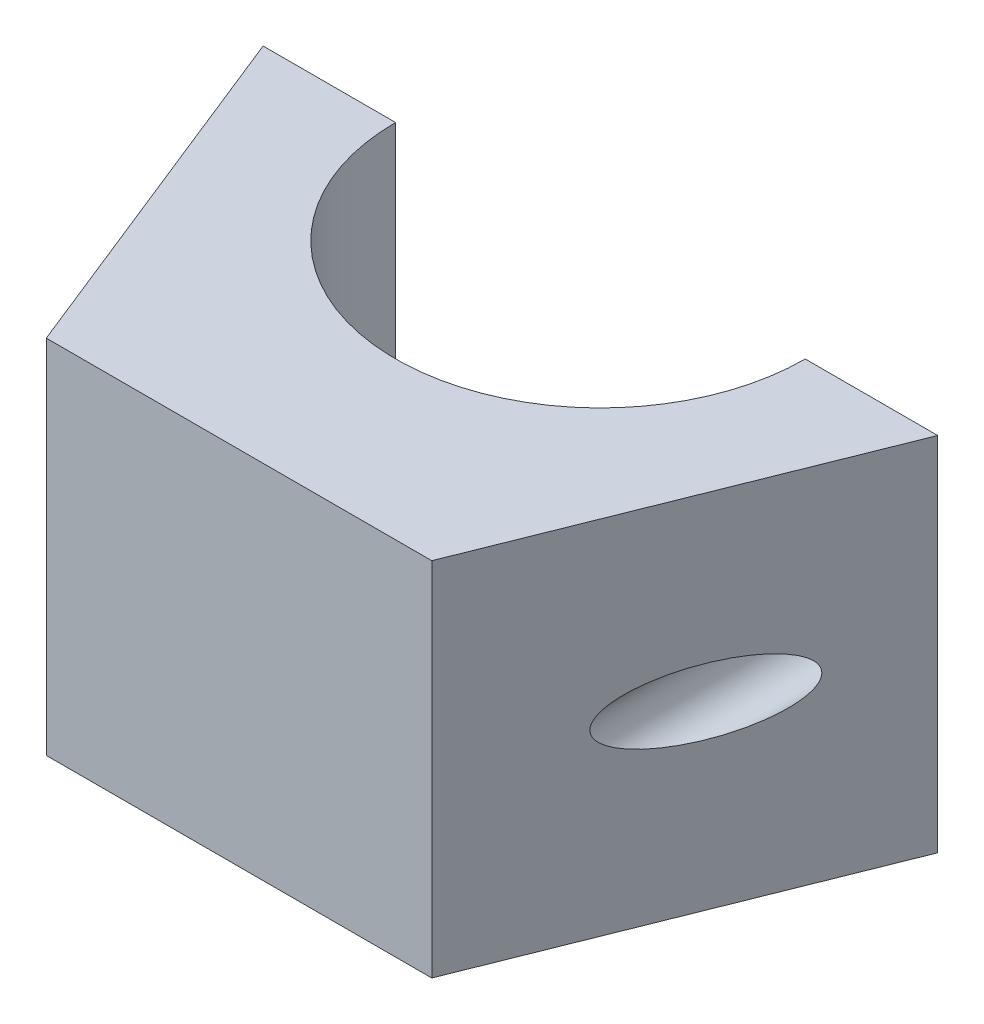
ISO-10303-21;
HEADER;
FILE_DESCRIPTION(('STEP AP214'),'2;1');
FILE_NAME('part.step','',(''),(''),'','','');
FILE_SCHEMA(('AUTOMOTIVE_DESIGN { 1 0 10303 214 1 1 1 1 }'));
ENDSEC;
DATA;
#1=APPLICATION_CONTEXT('core data for automotive mechanical design processes');
#2=APPLICATION_PROTOCOL_DEFINITION('international standard','automotive_design',2000,#1);
#3=PRODUCT_CONTEXT('',#1,'mechanical');
#4=PRODUCT('Part','Part','',(#3));
#5=PRODUCT_RELATED_PRODUCT_CATEGORY('part','',(#4));
#6=PRODUCT_DEFINITION_FORMATION('','',#4);
#7=PRODUCT_DEFINITION_CONTEXT('part definition',#1,'design');
#8=PRODUCT_DEFINITION('design','',#6,#7);
#9=PRODUCT_DEFINITION_SHAPE('','',#8);
#10=(LENGTH_UNIT() NAMED_UNIT(*) SI_UNIT(.MILLI.,.METRE.));
#11=(NAMED_UNIT(*) PLANE_ANGLE_UNIT() SI_UNIT($,.RADIAN.));
#12=(NAMED_UNIT(*) SI_UNIT($,.STERADIAN.) SOLID_ANGLE_UNIT());
#13=UNCERTAINTY_MEASURE_WITH_UNIT(LENGTH_MEASURE(1.E-05),#10,'distance_accuracy_value','');
#14=(GEOMETRIC_REPRESENTATION_CONTEXT(3) GLOBAL_UNCERTAINTY_ASSIGNED_CONTEXT((#13)) GLOBAL_UNIT_ASSIGNED_CONTEXT((#10,
#11,#12)) REPRESENTATION_CONTEXT('',''));
#15=CARTESIAN_POINT('',(0.,0.,0.));
#16=DIRECTION('',(0.,0.,1.));
#17=DIRECTION('',(1.,0.,0.));
#18=AXIS2_PLACEMENT_3D('',#15,#16,#17);
#19=CARTESIAN_POINT('',(-34.8161764705882,15.,11.9669117647059));
#20=DIRECTION('',(0.,0.,-1.));
#21=DIRECTION('',(-1.,0.,0.));
#22=AXIS2_PLACEMENT_3D('',#19,#20,#21);
#23=PLANE('',#22);
#24=DIRECTION('',(1.,0.,0.));
#25=VECTOR('',#24,1.);
#26=CARTESIAN_POINT('',(-34.8161764705882,0.,11.9669117647059));
#27=LINE('',#26,#25);
#28=CARTESIAN_POINT('',(-22.8161764705882,0.,11.9669117647059));
#29=VERTEX_POINT('',#28);
#30=CARTESIAN_POINT('',(-6.81617647058824,0.,11.9669117647059));
#31=VERTEX_POINT('',#30);
#32=EDGE_CURVE('E42',#29,#31,#27,.T.);
#33=ORIENTED_EDGE('',*,*,#32,.T.);
#34=DIRECTION('',(0.,1.,0.));
#35=VECTOR('',#34,1.);
#36=CARTESIAN_POINT('',(-6.81617647058824,0.,11.9669117647059));
#37=LINE('',#36,#35);
#38=CARTESIAN_POINT('',(-6.81617647058824,15.,11.9669117647059));
#39=VERTEX_POINT('',#38);
#40=EDGE_CURVE('E59',#31,#39,#37,.T.);
#41=ORIENTED_EDGE('',*,*,#40,.T.);
#42=DIRECTION('',(1.,0.,0.));
#43=VECTOR('',#42,1.);
#44=CARTESIAN_POINT('',(-34.8161764705882,15.,11.9669117647059));
#45=LINE('',#44,#43);
#46=CARTESIAN_POINT('',(-22.8161764705882,15.,11.9669117647059));
#47=VERTEX_POINT('',#46);
#48=EDGE_CURVE('E11',#47,#39,#45,.T.);
#49=ORIENTED_EDGE('',*,*,#48,.F.);
#50=DIRECTION('',(0.,1.,0.));
#51=VECTOR('',#50,1.);
#52=CARTESIAN_POINT('',(-22.8161764705882,0.,11.9669117647059));
#53=LINE('',#52,#51);
#54=EDGE_CURVE('E120',#29,#47,#53,.T.);
#55=ORIENTED_EDGE('',*,*,#54,.F.);
#56=EDGE_LOOP('',(#33,#41,#49,#55));
#57=FACE_BOUND('',#56,.T.);
#58=ADVANCED_FACE('F34',(#57),#23,.F.);
#59=CARTESIAN_POINT('',(0.,15.,0.));
#60=DIRECTION('',(0.,1.,0.));
#61=DIRECTION('',(0.,0.,1.));
#62=AXIS2_PLACEMENT_3D('',#59,#60,#61);
#63=PLANE('',#62);
#64=DIRECTION('',(-0.371390676354104,0.,0.928476690885259));
#65=VECTOR('',#64,1.);
#66=CARTESIAN_POINT('',(-1.74949290060852,15.,-0.699797160243408));
#67=LINE('',#66,#65);
#68=CARTESIAN_POINT('',(-0.816176470588239,15.,-3.03308823529411));
#69=VERTEX_POINT('',#68);
#70=EDGE_CURVE('E82',#69,#39,#67,.T.);
#71=ORIENTED_EDGE('',*,*,#70,.F.);
#72=DIRECTION('',(1.,0.,0.));
#73=VECTOR('',#72,1.);
#74=CARTESIAN_POINT('',(0.,15.,-3.03308823529411));
#75=LINE('',#74,#73);
#76=CARTESIAN_POINT('',(-6.31617647058824,15.,-3.03308823529411));
#77=VERTEX_POINT('',#76);
#78=EDGE_CURVE('E129',#77,#69,#75,.T.);
#79=ORIENTED_EDGE('',*,*,#78,.F.);
#80=CARTESIAN_POINT('',(-14.8161764705882,15.,-3.03308823529411));
#81=DIRECTION('',(0.,1.,0.));
#82=DIRECTION('',(0.,0.,1.));
#83=AXIS2_PLACEMENT_3D('',#80,#81,#82);
#84=CIRCLE('',#83,8.5);
#85=CARTESIAN_POINT('',(-23.3161764705882,15.,-3.03308823529411));
#86=VERTEX_POINT('',#85);
#87=EDGE_CURVE('E101',#86,#77,#84,.T.);
#88=ORIENTED_EDGE('',*,*,#87,.F.);
#89=DIRECTION('',(1.,0.,0.));
#90=VECTOR('',#89,1.);
#91=CARTESIAN_POINT('',(0.,15.,-3.03308823529411));
#92=LINE('',#91,#90);
#93=CARTESIAN_POINT('',(-28.8161764705882,15.,-3.0330882352941));
#94=VERTEX_POINT('',#93);
#95=EDGE_CURVE('E124',#94,#86,#92,.T.);
#96=ORIENTED_EDGE('',*,*,#95,.F.);
#97=DIRECTION('',(0.371390676354104,0.,0.928476690885259));
#98=VECTOR('',#97,1.);
#99=CARTESIAN_POINT('',(-23.7956389452333,15.,9.51825557809331));
#100=LINE('',#99,#98);
#101=EDGE_CURVE('E121',#94,#47,#100,.T.);
#102=ORIENTED_EDGE('',*,*,#101,.T.);
#103=ORIENTED_EDGE('',*,*,#48,.T.);
#104=EDGE_LOOP('',(#71,#79,#88,#96,#102,#103));
#105=FACE_BOUND('',#104,.T.);
#106=ADVANCED_FACE('F143',(#105),#63,.T.);
#107=CARTESIAN_POINT('',(0.,0.,0.));
#108=DIRECTION('',(0.,1.,0.));
#109=DIRECTION('',(0.,0.,1.));
#110=AXIS2_PLACEMENT_3D('',#107,#108,#109);
#111=PLANE('',#110);
#112=DIRECTION('',(1.,0.,0.));
#113=VECTOR('',#112,1.);
#114=CARTESIAN_POINT('',(0.,0.,-3.03308823529411));
#115=LINE('',#114,#113);
#116=CARTESIAN_POINT('',(-6.31617647058824,0.,-3.03308823529411));
#117=VERTEX_POINT('',#116);
#118=CARTESIAN_POINT('',(-0.816176470588239,0.,-3.03308823529411));
#119=VERTEX_POINT('',#118);
#120=EDGE_CURVE('E109',#117,#119,#115,.T.);
#121=ORIENTED_EDGE('',*,*,#120,.T.);
#122=DIRECTION('',(-0.371390676354104,0.,0.928476690885259));
#123=VECTOR('',#122,1.);
#124=CARTESIAN_POINT('',(-1.74949290060852,0.,-0.699797160243408));
#125=LINE('',#124,#123);
#126=EDGE_CURVE('E112',#119,#31,#125,.T.);
#127=ORIENTED_EDGE('',*,*,#126,.T.);
#128=ORIENTED_EDGE('',*,*,#32,.F.);
#129=DIRECTION('',(0.371390676354104,0.,0.928476690885259));
#130=VECTOR('',#129,1.);
#131=CARTESIAN_POINT('',(-23.7956389452333,0.,9.51825557809331));
#132=LINE('',#131,#130);
#133=CARTESIAN_POINT('',(-28.8161764705882,0.,-3.0330882352941));
#134=VERTEX_POINT('',#133);
#135=EDGE_CURVE('E88',#134,#29,#132,.T.);
#136=ORIENTED_EDGE('',*,*,#135,.F.);
#137=DIRECTION('',(1.,0.,0.));
#138=VECTOR('',#137,1.);
#139=CARTESIAN_POINT('',(0.,0.,-3.03308823529411));
#140=LINE('',#139,#138);
#141=CARTESIAN_POINT('',(-23.3161764705882,0.,-3.03308823529411));
#142=VERTEX_POINT('',#141);
#143=EDGE_CURVE('E50',#134,#142,#140,.T.);
#144=ORIENTED_EDGE('',*,*,#143,.T.);
#145=CARTESIAN_POINT('',(-14.8161764705882,0.,-3.03308823529411));
#146=DIRECTION('',(0.,1.,0.));
#147=DIRECTION('',(0.,0.,1.));
#148=AXIS2_PLACEMENT_3D('',#145,#146,#147);
#149=CIRCLE('',#148,8.5);
#150=EDGE_CURVE('E99',#142,#117,#149,.T.);
#151=ORIENTED_EDGE('',*,*,#150,.T.);
#152=EDGE_LOOP('',(#121,#127,#128,#136,#144,#151));
#153=FACE_BOUND('',#152,.T.);
#154=ADVANCED_FACE('F114',(#153),#111,.F.);
#155=CARTESIAN_POINT('',(-1.74949290060852,0.,-0.699797160243408));
#156=DIRECTION('',(-0.928476690885259,0.,-0.371390676354104));
#157=DIRECTION('',(-0.371390676354104,0.,0.928476690885259));
#158=AXIS2_PLACEMENT_3D('',#155,#156,#157);
#159=PLANE('',#158);
#160=CARTESIAN_POINT('',(-3.56617647058824,7.5,3.84191176470588));
#161=DIRECTION('',(-0.928476690885259,0.,-0.371390676354104));
#162=DIRECTION('',(0.371390676354104,0.,-0.928476690885259));
#163=AXIS2_PLACEMENT_3D('',#160,#161,#162);
#164=ELLIPSE('',#163,3.70230080490497,1.375);
#165=CARTESIAN_POINT('',(-2.19117647058824,7.5,0.404411764705881));
#166=VERTEX_POINT('',#165);
#167=EDGE_CURVE('E125',#166,#166,#164,.T.);
#168=ORIENTED_EDGE('',*,*,#167,.T.);
#169=EDGE_LOOP('',(#168));
#170=FACE_BOUND('',#169,.T.);
#171=ORIENTED_EDGE('',*,*,#70,.T.);
#172=ORIENTED_EDGE('',*,*,#40,.F.);
#173=ORIENTED_EDGE('',*,*,#126,.F.);
#174=DIRECTION('',(0.,1.,0.));
#175=VECTOR('',#174,1.);
#176=CARTESIAN_POINT('',(-0.816176470588239,0.,-3.03308823529411));
#177=LINE('',#176,#175);
#178=EDGE_CURVE('E105',#119,#69,#177,.T.);
#179=ORIENTED_EDGE('',*,*,#178,.T.);
#180=EDGE_LOOP('',(#171,#172,#173,#179));
#181=FACE_BOUND('',#180,.T.);
#182=ADVANCED_FACE('F141',(#170,#181),#159,.F.);
#183=CARTESIAN_POINT('',(0.,0.,-3.03308823529411));
#184=DIRECTION('',(0.,0.,1.));
#185=DIRECTION('',(1.,0.,0.));
#186=AXIS2_PLACEMENT_3D('',#183,#184,#185);
#187=PLANE('',#186);
#188=CARTESIAN_POINT('',(-3.56617647058824,7.5,-3.03308823529411));
#189=DIRECTION('',(0.,0.,-1.));
#190=DIRECTION('',(-1.,0.,0.));
#191=AXIS2_PLACEMENT_3D('',#188,#189,#190);
#192=CIRCLE('',#191,1.375);
#193=CARTESIAN_POINT('',(-4.94117647058824,7.5,-3.03308823529411));
#194=VERTEX_POINT('',#193);
#195=EDGE_CURVE('E193',#194,#194,#192,.T.);
#196=ORIENTED_EDGE('',*,*,#195,.F.);
#197=EDGE_LOOP('',(#196));
#198=FACE_BOUND('',#197,.T.);
#199=ORIENTED_EDGE('',*,*,#78,.T.);
#200=ORIENTED_EDGE('',*,*,#178,.F.);
#201=ORIENTED_EDGE('',*,*,#120,.F.);
#202=DIRECTION('',(0.,1.,0.));
#203=VECTOR('',#202,1.);
#204=CARTESIAN_POINT('',(-6.31617647058824,0.,-3.03308823529411));
#205=LINE('',#204,#203);
#206=EDGE_CURVE('E95',#117,#77,#205,.T.);
#207=ORIENTED_EDGE('',*,*,#206,.T.);
#208=EDGE_LOOP('',(#199,#200,#201,#207));
#209=FACE_BOUND('',#208,.T.);
#210=ADVANCED_FACE('F110',(#198,#209),#187,.F.);
#211=CARTESIAN_POINT('',(-14.8161764705882,0.,-3.03308823529411));
#212=DIRECTION('',(0.,1.,0.));
#213=DIRECTION('',(0.,0.,1.));
#214=AXIS2_PLACEMENT_3D('',#211,#212,#213);
#215=CYLINDRICAL_SURFACE('',#214,8.5);
#216=ORIENTED_EDGE('',*,*,#87,.T.);
#217=ORIENTED_EDGE('',*,*,#206,.F.);
#218=ORIENTED_EDGE('',*,*,#150,.F.);
#219=DIRECTION('',(0.,1.,0.));
#220=VECTOR('',#219,1.);
#221=CARTESIAN_POINT('',(-23.3161764705882,0.,-3.03308823529411));
#222=LINE('',#221,#220);
#223=EDGE_CURVE('E106',#142,#86,#222,.T.);
#224=ORIENTED_EDGE('',*,*,#223,.T.);
#225=EDGE_LOOP('',(#216,#217,#218,#224));
#226=FACE_BOUND('',#225,.T.);
#227=ADVANCED_FACE('F97',(#226),#215,.F.);
#228=CARTESIAN_POINT('',(0.,0.,-3.03308823529411));
#229=DIRECTION('',(0.,0.,1.));
#230=DIRECTION('',(1.,0.,0.));
#231=AXIS2_PLACEMENT_3D('',#228,#229,#230);
#232=PLANE('',#231);
#233=CARTESIAN_POINT('',(-26.0661764705882,7.5,-3.03308823529411));
#234=DIRECTION('',(0.,0.,-1.));
#235=DIRECTION('',(-1.,0.,0.));
#236=AXIS2_PLACEMENT_3D('',#233,#234,#235);
#237=CIRCLE('',#236,1.375);
#238=CARTESIAN_POINT('',(-27.4411764705882,7.5,-3.03308823529411));
#239=VERTEX_POINT('',#238);
#240=EDGE_CURVE('E192',#239,#239,#237,.T.);
#241=ORIENTED_EDGE('',*,*,#240,.F.);
#242=EDGE_LOOP('',(#241));
#243=FACE_BOUND('',#242,.T.);
#244=ORIENTED_EDGE('',*,*,#95,.T.);
#245=ORIENTED_EDGE('',*,*,#223,.F.);
#246=ORIENTED_EDGE('',*,*,#143,.F.);
#247=DIRECTION('',(0.,1.,0.));
#248=VECTOR('',#247,1.);
#249=CARTESIAN_POINT('',(-28.8161764705882,0.,-3.0330882352941));
#250=LINE('',#249,#248);
#251=EDGE_CURVE('E135',#134,#94,#250,.T.);
#252=ORIENTED_EDGE('',*,*,#251,.T.);
#253=EDGE_LOOP('',(#244,#245,#246,#252));
#254=FACE_BOUND('',#253,.T.);
#255=ADVANCED_FACE('F147',(#243,#254),#232,.F.);
#256=CARTESIAN_POINT('',(-23.7956389452333,0.,9.51825557809331));
#257=DIRECTION('',(-0.928476690885259,0.,0.371390676354104));
#258=DIRECTION('',(0.371390676354104,0.,0.928476690885259));
#259=AXIS2_PLACEMENT_3D('',#256,#257,#258);
#260=PLANE('',#259);
#261=CARTESIAN_POINT('',(-26.0661764705882,7.5,3.84191176470591));
#262=DIRECTION('',(-0.928476690885259,0.,0.371390676354104));
#263=DIRECTION('',(-0.371390676354104,0.,-0.928476690885259));
#264=AXIS2_PLACEMENT_3D('',#261,#262,#263);
#265=ELLIPSE('',#264,3.70230080490498,1.375);
#266=CARTESIAN_POINT('',(-27.4411764705882,7.5,0.404411764705907));
#267=VERTEX_POINT('',#266);
#268=EDGE_CURVE('E37',#267,#267,#265,.T.);
#269=ORIENTED_EDGE('',*,*,#268,.F.);
#270=EDGE_LOOP('',(#269));
#271=FACE_BOUND('',#270,.T.);
#272=ORIENTED_EDGE('',*,*,#101,.F.);
#273=ORIENTED_EDGE('',*,*,#251,.F.);
#274=ORIENTED_EDGE('',*,*,#135,.T.);
#275=ORIENTED_EDGE('',*,*,#54,.T.);
#276=EDGE_LOOP('',(#272,#273,#274,#275));
#277=FACE_BOUND('',#276,.T.);
#278=ADVANCED_FACE('F146',(#271,#277),#260,.T.);
#279=CARTESIAN_POINT('',(-26.0661764705882,7.5,11.9669117647059));
#280=DIRECTION('',(0.,0.,-1.));
#281=DIRECTION('',(-1.,0.,0.));
#282=AXIS2_PLACEMENT_3D('',#279,#280,#281);
#283=CYLINDRICAL_SURFACE('',#282,1.375);
#284=ORIENTED_EDGE('',*,*,#268,.T.);
#285=EDGE_LOOP('',(#284));
#286=FACE_BOUND('',#285,.T.);
#287=ORIENTED_EDGE('',*,*,#240,.T.);
#288=EDGE_LOOP('',(#287));
#289=FACE_BOUND('',#288,.T.);
#290=ADVANCED_FACE('F155',(#286,#289),#283,.F.);
#291=CARTESIAN_POINT('',(-3.56617647058824,7.5,11.9669117647059));
#292=DIRECTION('',(0.,0.,-1.));
#293=DIRECTION('',(-1.,0.,0.));
#294=AXIS2_PLACEMENT_3D('',#291,#292,#293);
#295=CYLINDRICAL_SURFACE('',#294,1.375);
#296=ORIENTED_EDGE('',*,*,#195,.T.);
#297=EDGE_LOOP('',(#296));
#298=FACE_BOUND('',#297,.T.);
#299=ORIENTED_EDGE('',*,*,#167,.F.);
#300=EDGE_LOOP('',(#299));
#301=FACE_BOUND('',#300,.T.);
#302=ADVANCED_FACE('F180',(#298,#301),#295,.F.);
#303=CLOSED_SHELL('',(#58,#106,#154,#182,#210,#227,#255,#278,#290,#302));
#304=MANIFOLD_SOLID_BREP('B2',#303);
#305=ADVANCED_BREP_SHAPE_REPRESENTATION('',(#18,#304),#14);
#306=SHAPE_DEFINITION_REPRESENTATION(#9,#305);
ENDSEC;
END-ISO-10303-21;
